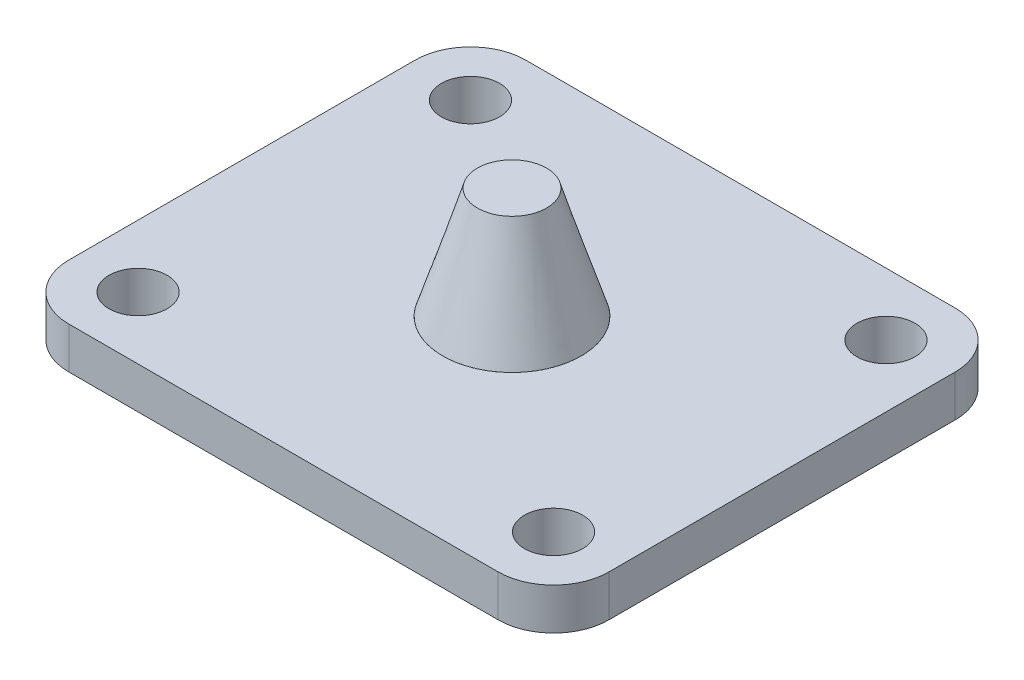
ISO-10303-21;
HEADER;
FILE_DESCRIPTION(('STEP AP214'),'2;1');
FILE_NAME('part.step','',(''),(''),'','','');
FILE_SCHEMA(('AUTOMOTIVE_DESIGN { 1 0 10303 214 1 1 1 1 }'));
ENDSEC;
DATA;
#1=APPLICATION_CONTEXT('core data for automotive mechanical design processes');
#2=APPLICATION_PROTOCOL_DEFINITION('international standard','automotive_design',2000,#1);
#3=PRODUCT_CONTEXT('',#1,'mechanical');
#4=PRODUCT('Part','Part','',(#3));
#5=PRODUCT_RELATED_PRODUCT_CATEGORY('part','',(#4));
#6=PRODUCT_DEFINITION_FORMATION('','',#4);
#7=PRODUCT_DEFINITION_CONTEXT('part definition',#1,'design');
#8=PRODUCT_DEFINITION('design','',#6,#7);
#9=PRODUCT_DEFINITION_SHAPE('','',#8);
#10=(LENGTH_UNIT() NAMED_UNIT(*) SI_UNIT(.MILLI.,.METRE.));
#11=(NAMED_UNIT(*) PLANE_ANGLE_UNIT() SI_UNIT($,.RADIAN.));
#12=(NAMED_UNIT(*) SI_UNIT($,.STERADIAN.) SOLID_ANGLE_UNIT());
#13=UNCERTAINTY_MEASURE_WITH_UNIT(LENGTH_MEASURE(1.E-05),#10,'distance_accuracy_value','');
#14=(GEOMETRIC_REPRESENTATION_CONTEXT(3) GLOBAL_UNCERTAINTY_ASSIGNED_CONTEXT((#13)) GLOBAL_UNIT_ASSIGNED_CONTEXT((#10,
#11,#12)) REPRESENTATION_CONTEXT('',''));
#15=CARTESIAN_POINT('',(0.,0.,0.));
#16=DIRECTION('',(0.,0.,1.));
#17=DIRECTION('',(1.,0.,0.));
#18=AXIS2_PLACEMENT_3D('',#15,#16,#17);
#19=CARTESIAN_POINT('',(19.5000000000001,11.,-16.5000000000005));
#20=DIRECTION('',(0.,1.,0.));
#21=DIRECTION('',(0.,0.,1.));
#22=AXIS2_PLACEMENT_3D('',#19,#20,#21);
#23=PLANE('',#22);
#24=CARTESIAN_POINT('',(19.5000000000001,11.,-16.5000000000005));
#25=DIRECTION('',(0.,1.,0.));
#26=DIRECTION('',(0.,0.,1.));
#27=AXIS2_PLACEMENT_3D('',#24,#25,#26);
#28=CIRCLE('',#27,2.5);
#29=CARTESIAN_POINT('',(21.8871613618667,11.,-15.757396046058));
#30=VERTEX_POINT('',#29);
#31=EDGE_CURVE('E12',#30,#30,#28,.T.);
#32=ORIENTED_EDGE('',*,*,#31,.T.);
#33=EDGE_LOOP('',(#32));
#34=FACE_BOUND('',#33,.T.);
#35=ADVANCED_FACE('F51',(#34),#23,.T.);
#36=CARTESIAN_POINT('',(19.5000000000001,3.,-16.5000000000005));
#37=DIRECTION('',(0.,1.,0.));
#38=DIRECTION('',(0.,0.,1.));
#39=AXIS2_PLACEMENT_3D('',#36,#37,#38);
#40=PLANE('',#39);
#41=CARTESIAN_POINT('',(19.5000000000001,3.,-16.5000000000005));
#42=DIRECTION('',(0.,1.,0.));
#43=DIRECTION('',(0.,0.,1.));
#44=AXIS2_PLACEMENT_3D('',#41,#42,#43);
#45=CIRCLE('',#44,5.);
#46=CARTESIAN_POINT('',(23.7940843704918,3.,-13.9385864412211));
#47=VERTEX_POINT('',#46);
#48=EDGE_CURVE('E59',#47,#47,#45,.T.);
#49=ORIENTED_EDGE('',*,*,#48,.F.);
#50=EDGE_LOOP('',(#49));
#51=FACE_BOUND('',#50,.T.);
#52=ADVANCED_FACE('F82',(#51),#40,.F.);
#53=CARTESIAN_POINT('',(23.7940843704918,3.,-13.9385864412211));
#54=CARTESIAN_POINT('',(21.8871613618667,11.,-15.757396046058));
#55=CARTESIAN_POINT('',(28.9169114880506,3.,-22.5267551822045));
#56=CARTESIAN_POINT('',(23.3723692697519,11.,-20.5317187697912));
#57=CARTESIAN_POINT('',(20.3287427470672,3.,-27.6495822997633));
#58=CARTESIAN_POINT('',(18.5980465460187,11.,-22.0169266776763));
#59=CARTESIAN_POINT('',(15.2059156295084,3.,-19.06141355878));
#60=CARTESIAN_POINT('',(17.1128386381335,11.,-17.2426039539431));
#61=CARTESIAN_POINT('',(10.0830885119496,3.,-10.4732448177966));
#62=CARTESIAN_POINT('',(15.6276307302483,11.,-12.4682812302099));
#63=CARTESIAN_POINT('',(18.671257252933,3.,-5.35041770023775));
#64=CARTESIAN_POINT('',(20.4019534539816,11.,-10.9830733223247));
#65=CARTESIAN_POINT('',(23.7940843704918,3.,-13.9385864412211));
#66=CARTESIAN_POINT('',(21.8871613618667,11.,-15.757396046058));
#67=(BOUNDED_SURFACE() B_SPLINE_SURFACE(3,1,((#53,#54),(#55,#56),(#57,#58),(#59,#60),(#61,#62),
(#63,#64),(#65,#66)),.UNSPECIFIED.,.T.,.F.,.F.) B_SPLINE_SURFACE_WITH_KNOTS((4,3,4),(2,2),(0.,
0.5,1.),(0.,1.),.UNSPECIFIED.) GEOMETRIC_REPRESENTATION_ITEM() RATIONAL_B_SPLINE_SURFACE(((1.,
1.),(0.333333333333333,0.333333333333333),(0.333333333333333,0.333333333333333),(1.,1.),
(0.333333333333333,0.333333333333333),(0.333333333333333,0.333333333333333),(1.,1.))) REPRESENTATION_ITEM('') SURFACE());
#68=CARTESIAN_POINT('',(23.7940843704918,3.,-13.9385864412211));
#69=CARTESIAN_POINT('',(23.774220589152,3.08333333333333,-13.9575323746049));
#70=CARTESIAN_POINT('',(23.7543568078121,3.16666666666667,-13.9764783079886));
#71=CARTESIAN_POINT('',(23.7146292451324,3.33333333333333,-14.014370174756));
#72=CARTESIAN_POINT('',(23.6947654637926,3.41666666666667,-14.0333161081397));
#73=CARTESIAN_POINT('',(23.6550379011129,3.58333333333333,-14.0712079749072));
#74=CARTESIAN_POINT('',(23.6351741197731,3.66666666666667,-14.0901539082909));
#75=CARTESIAN_POINT('',(23.5954465570934,3.83333333333333,-14.1280457750583));
#76=CARTESIAN_POINT('',(23.5755827757535,3.91666666666667,-14.146991708442));
#77=CARTESIAN_POINT('',(23.5358552130738,4.08333333333333,-14.1848835752095));
#78=CARTESIAN_POINT('',(23.515991431734,4.16666666666667,-14.2038295085932));
#79=CARTESIAN_POINT('',(23.4762638690543,4.33333333333333,-14.2417213753606));
#80=CARTESIAN_POINT('',(23.4564000877145,4.41666666666667,-14.2606673087443));
#81=CARTESIAN_POINT('',(23.4166725250348,4.58333333333333,-14.2985591755118));
#82=CARTESIAN_POINT('',(23.3968087436949,4.66666666666667,-14.3175051088955));
#83=CARTESIAN_POINT('',(23.3570811810152,4.83333333333333,-14.3553969756629));
#84=CARTESIAN_POINT('',(23.3372173996754,4.91666666666667,-14.3743429090466));
#85=CARTESIAN_POINT('',(23.2974898369957,5.08333333333333,-14.4122347758141));
#86=CARTESIAN_POINT('',(23.2776260556559,5.16666666666667,-14.4311807091978));
#87=CARTESIAN_POINT('',(23.2378984929762,5.33333333333333,-14.4690725759652));
#88=CARTESIAN_POINT('',(23.2180347116363,5.41666666666667,-14.4880185093489));
#89=CARTESIAN_POINT('',(23.1783071489566,5.58333333333333,-14.5259103761164));
#90=CARTESIAN_POINT('',(23.1584433676168,5.66666666666667,-14.5448563095001));
#91=CARTESIAN_POINT('',(23.1187158049371,5.83333333333333,-14.5827481762675));
#92=CARTESIAN_POINT('',(23.0988520235972,5.91666666666667,-14.6016941096512));
#93=CARTESIAN_POINT('',(23.0591244609176,6.08333333333333,-14.6395859764187));
#94=CARTESIAN_POINT('',(23.0392606795777,6.16666666666667,-14.6585319098024));
#95=CARTESIAN_POINT('',(22.999533116898,6.33333333333333,-14.6964237765698));
#96=CARTESIAN_POINT('',(22.9796693355582,6.41666666666667,-14.7153697099535));
#97=CARTESIAN_POINT('',(22.9399417728785,6.58333333333333,-14.753261576721));
#98=CARTESIAN_POINT('',(22.9200779915386,6.66666666666667,-14.7722075101047));
#99=CARTESIAN_POINT('',(22.880350428859,6.83333333333333,-14.8100993768721));
#100=CARTESIAN_POINT('',(22.8604866475191,6.91666666666667,-14.8290453102558));
#101=CARTESIAN_POINT('',(22.8207590848394,7.08333333333333,-14.8669371770233));
#102=CARTESIAN_POINT('',(22.8008953034996,7.16666666666667,-14.885883110407));
#103=CARTESIAN_POINT('',(22.7611677408199,7.33333333333333,-14.9237749771744));
#104=CARTESIAN_POINT('',(22.74130395948,7.41666666666667,-14.9427209105581));
#105=CARTESIAN_POINT('',(22.7015763968004,7.58333333333333,-14.9806127773256));
#106=CARTESIAN_POINT('',(22.6817126154605,7.66666666666667,-14.9995587107093));
#107=CARTESIAN_POINT('',(22.6419850527808,7.83333333333333,-15.0374505774767));
#108=CARTESIAN_POINT('',(22.622121271441,7.91666666666667,-15.0563965108604));
#109=CARTESIAN_POINT('',(22.5823937087613,8.08333333333333,-15.0942883776279));
#110=CARTESIAN_POINT('',(22.5625299274214,8.16666666666667,-15.1132343110116));
#111=CARTESIAN_POINT('',(22.5228023647418,8.33333333333333,-15.151126177779));
#112=CARTESIAN_POINT('',(22.5029385834019,8.41666666666667,-15.1700721111627));
#113=CARTESIAN_POINT('',(22.4632110207222,8.58333333333333,-15.2079639779302));
#114=CARTESIAN_POINT('',(22.4433472393824,8.66666666666667,-15.2269099113139));
#115=CARTESIAN_POINT('',(22.4036196767027,8.83333333333333,-15.2648017780813));
#116=CARTESIAN_POINT('',(22.3837558953628,8.91666666666667,-15.283747711465));
#117=CARTESIAN_POINT('',(22.3440283326832,9.08333333333333,-15.3216395782325));
#118=CARTESIAN_POINT('',(22.3241645513433,9.16666666666667,-15.3405855116162));
#119=CARTESIAN_POINT('',(22.2844369886636,9.33333333333333,-15.3784773783836));
#120=CARTESIAN_POINT('',(22.2645732073238,9.41666666666667,-15.3974233117673));
#121=CARTESIAN_POINT('',(22.2248456446441,9.58333333333333,-15.4353151785348));
#122=CARTESIAN_POINT('',(22.2049818633042,9.66666666666667,-15.4542611119185));
#123=CARTESIAN_POINT('',(22.1652543006245,9.83333333333333,-15.4921529786859));
#124=CARTESIAN_POINT('',(22.1453905192847,9.91666666666667,-15.5110989120696));
#125=CARTESIAN_POINT('',(22.105662956605,10.0833333333333,-15.5489907788371));
#126=CARTESIAN_POINT('',(22.0857991752652,10.1666666666667,-15.5679367122208));
#127=CARTESIAN_POINT('',(22.0460716125855,10.3333333333333,-15.6058285789882));
#128=CARTESIAN_POINT('',(22.0262078312456,10.4166666666667,-15.6247745123719));
#129=CARTESIAN_POINT('',(21.9864802685659,10.5833333333333,-15.6626663791394));
#130=CARTESIAN_POINT('',(21.9666164872261,10.6666666666667,-15.6816123125231));
#131=CARTESIAN_POINT('',(21.9268889245464,10.8333333333333,-15.7195041792905));
#132=CARTESIAN_POINT('',(21.9070251432066,10.9166666666667,-15.7384501126742));
#133=CARTESIAN_POINT('',(21.8871613618667,11.,-15.757396046058));
#134=B_SPLINE_CURVE_WITH_KNOTS('',3,(#68,#69,#70,#71,#72,#73,#74,#75,#76,#77,#78,#79,#80,#81,
#82,#83,#84,#85,#86,#87,#88,#89,#90,#91,#92,#93,#94,#95,#96,#97,#98,#99,#100,#101,#102,#103,
#104,#105,#106,#107,#108,#109,#110,#111,#112,#113,#114,#115,#116,#117,#118,#119,#120,#121,#122,
#123,#124,#125,#126,#127,#128,#129,#130,#131,#132,#133),.UNSPECIFIED.,.F.,.F.,(4,2,2,2,2,2,2,2,
2,2,2,2,2,2,2,2,2,2,2,2,2,2,2,2,2,2,2,2,2,2,2,2,4),(0.,0.26321410260105,0.526428205202101,
0.789642307803153,1.0528564104042,1.31607051300526,1.57928461560631,1.84249871820736,
2.10571282080841,2.36892692340946,2.63214102601051,2.89535512861156,3.15856923121261,
3.42178333381366,3.68499743641471,3.94821153901576,4.21142564161681,4.47463974421787,
4.73785384681892,5.00106794941997,5.26428205202102,5.52749615462207,5.79071025722312,
6.05392435982417,6.31713846242523,6.58035256502628,6.84356666762733,7.10678077022838,
7.36999487282943,7.63320897543048,7.89642307803153,8.15963718063258,8.42285128323363),.UNSPECIFIED.);
#135=EDGE_CURVE('BSEAM90',#47,#30,#134,.T.);
#136=ORIENTED_EDGE('',*,*,#48,.T.);
#137=ORIENTED_EDGE('',*,*,#31,.F.);
#138=ORIENTED_EDGE('',*,*,#135,.T.);
#139=ORIENTED_EDGE('',*,*,#135,.F.);
#140=EDGE_LOOP('',(#136,#138,#137,#139));
#141=FACE_BOUND('',#140,.T.);
#142=ADVANCED_FACE('F90',(#141),#67,.T.);
#143=CLOSED_SHELL('',(#35,#52,#142));
#144=MANIFOLD_SOLID_BREP('B2',#143);
#145=CARTESIAN_POINT('',(0.,3.,0.));
#146=DIRECTION('',(0.,-1.,0.));
#147=DIRECTION('',(0.,0.,-1.));
#148=AXIS2_PLACEMENT_3D('',#145,#146,#147);
#149=PLANE('',#148);
#150=CARTESIAN_POINT('',(19.5000000000001,3.,-16.5000000000005));
#151=DIRECTION('',(0.,1.,0.));
#152=DIRECTION('',(0.,0.,1.));
#153=AXIS2_PLACEMENT_3D('',#150,#151,#152);
#154=CIRCLE('',#153,5.);
#155=CARTESIAN_POINT('',(19.5000000000001,3.,-11.5000000000005));
#156=VERTEX_POINT('',#155);
#157=EDGE_CURVE('E343',#156,#156,#154,.T.);
#158=ORIENTED_EDGE('',*,*,#157,.F.);
#159=EDGE_LOOP('',(#158));
#160=FACE_BOUND('',#159,.T.);
#161=DIRECTION('',(0.,0.,1.));
#162=VECTOR('',#161,1.);
#163=CARTESIAN_POINT('',(0.,3.,0.));
#164=LINE('',#163,#162);
#165=CARTESIAN_POINT('',(0.,3.,-29.0000000000001));
#166=VERTEX_POINT('',#165);
#167=CARTESIAN_POINT('',(0.,3.,-4.00000000000006));
#168=VERTEX_POINT('',#167);
#169=EDGE_CURVE('E254',#166,#168,#164,.T.);
#170=ORIENTED_EDGE('',*,*,#169,.T.);
#171=CARTESIAN_POINT('',(4.,3.,-4.00000000000006));
#172=DIRECTION('',(0.,-1.,0.));
#173=DIRECTION('',(0.,0.,-1.));
#174=AXIS2_PLACEMENT_3D('',#171,#172,#173);
#175=CIRCLE('',#174,4.);
#176=CARTESIAN_POINT('',(4.00000000000006,3.,0.));
#177=VERTEX_POINT('',#176);
#178=EDGE_CURVE('E278',#168,#177,#175,.F.);
#179=ORIENTED_EDGE('',*,*,#178,.T.);
#180=DIRECTION('',(1.,0.,0.));
#181=VECTOR('',#180,1.);
#182=CARTESIAN_POINT('',(0.,3.,0.));
#183=LINE('',#182,#181);
#184=CARTESIAN_POINT('',(35.0000000000004,3.,-4.88807387438045E-13));
#185=VERTEX_POINT('',#184);
#186=EDGE_CURVE('E231',#177,#185,#183,.T.);
#187=ORIENTED_EDGE('',*,*,#186,.T.);
#188=CARTESIAN_POINT('',(35.0000000000004,3.,-4.00000000000049));
#189=DIRECTION('',(0.,-1.,0.));
#190=DIRECTION('',(0.,0.,-1.));
#191=AXIS2_PLACEMENT_3D('',#188,#189,#190);
#192=CIRCLE('',#191,4.);
#193=CARTESIAN_POINT('',(39.0000000000004,3.,-4.00000000000054));
#194=VERTEX_POINT('',#193);
#195=EDGE_CURVE('E270',#185,#194,#192,.F.);
#196=ORIENTED_EDGE('',*,*,#195,.T.);
#197=DIRECTION('',(0.,0.,-1.));
#198=VECTOR('',#197,1.);
#199=CARTESIAN_POINT('',(39.0000000000004,3.,-5.44671088859535E-13));
#200=LINE('',#199,#198);
#201=CARTESIAN_POINT('',(39.0000000000001,3.,-29.0000000000005));
#202=VERTEX_POINT('',#201);
#203=EDGE_CURVE('E293',#194,#202,#200,.T.);
#204=ORIENTED_EDGE('',*,*,#203,.T.);
#205=CARTESIAN_POINT('',(35.,3.,-29.0000000000005));
#206=DIRECTION('',(0.,-1.,0.));
#207=DIRECTION('',(0.,0.,-1.));
#208=AXIS2_PLACEMENT_3D('',#205,#206,#207);
#209=CIRCLE('',#208,4.);
#210=CARTESIAN_POINT('',(35.,3.,-33.0000000000005));
#211=VERTEX_POINT('',#210);
#212=EDGE_CURVE('E166',#202,#211,#209,.F.);
#213=ORIENTED_EDGE('',*,*,#212,.T.);
#214=DIRECTION('',(-1.,0.,0.));
#215=VECTOR('',#214,1.);
#216=CARTESIAN_POINT('',(0.,3.,-33.));
#217=LINE('',#216,#215);
#218=CARTESIAN_POINT('',(3.99999999999994,3.,-33.0000000000001));
#219=VERTEX_POINT('',#218);
#220=EDGE_CURVE('E256',#211,#219,#217,.T.);
#221=ORIENTED_EDGE('',*,*,#220,.T.);
#222=CARTESIAN_POINT('',(4.,3.,-29.0000000000001));
#223=DIRECTION('',(0.,-1.,0.));
#224=DIRECTION('',(0.,0.,-1.));
#225=AXIS2_PLACEMENT_3D('',#222,#223,#224);
#226=CIRCLE('',#225,4.);
#227=EDGE_CURVE('E275',#219,#166,#226,.F.);
#228=ORIENTED_EDGE('',*,*,#227,.T.);
#229=EDGE_LOOP('',(#170,#179,#187,#196,#204,#213,#221,#228));
#230=FACE_BOUND('',#229,.T.);
#231=CARTESIAN_POINT('',(4.49999999999967,3.,-28.5000000000001));
#232=DIRECTION('',(0.,1.,0.));
#233=DIRECTION('',(0.,0.,1.));
#234=AXIS2_PLACEMENT_3D('',#231,#232,#233);
#235=CIRCLE('',#234,2.1000000000003);
#236=CARTESIAN_POINT('',(4.49999999999967,3.,-26.3999999999998));
#237=VERTEX_POINT('',#236);
#238=EDGE_CURVE('E248',#237,#237,#235,.T.);
#239=ORIENTED_EDGE('',*,*,#238,.F.);
#240=EDGE_LOOP('',(#239));
#241=FACE_BOUND('',#240,.T.);
#242=CARTESIAN_POINT('',(34.4999999999997,3.,-28.5000000000005));
#243=DIRECTION('',(0.,1.,0.));
#244=DIRECTION('',(0.,0.,1.));
#245=AXIS2_PLACEMENT_3D('',#242,#243,#244);
#246=CIRCLE('',#245,2.10000000000019);
#247=CARTESIAN_POINT('',(34.4999999999997,3.,-26.4000000000003));
#248=VERTEX_POINT('',#247);
#249=EDGE_CURVE('E315',#248,#248,#246,.T.);
#250=ORIENTED_EDGE('',*,*,#249,.F.);
#251=EDGE_LOOP('',(#250));
#252=FACE_BOUND('',#251,.T.);
#253=CARTESIAN_POINT('',(34.4999999999999,3.,-4.50000000000048));
#254=DIRECTION('',(0.,1.,0.));
#255=DIRECTION('',(0.,0.,1.));
#256=AXIS2_PLACEMENT_3D('',#253,#254,#255);
#257=CIRCLE('',#256,2.10000000000022);
#258=CARTESIAN_POINT('',(34.4999999999999,3.,-2.40000000000026));
#259=VERTEX_POINT('',#258);
#260=EDGE_CURVE('E323',#259,#259,#257,.T.);
#261=ORIENTED_EDGE('',*,*,#260,.F.);
#262=EDGE_LOOP('',(#261));
#263=FACE_BOUND('',#262,.T.);
#264=CARTESIAN_POINT('',(4.5,3.,-4.50000000000006));
#265=DIRECTION('',(0.,1.,0.));
#266=DIRECTION('',(0.,0.,1.));
#267=AXIS2_PLACEMENT_3D('',#264,#265,#266);
#268=CIRCLE('',#267,2.09999999999998);
#269=CARTESIAN_POINT('',(4.5,3.,-2.40000000000008));
#270=VERTEX_POINT('',#269);
#271=EDGE_CURVE('E331',#270,#270,#268,.T.);
#272=ORIENTED_EDGE('',*,*,#271,.F.);
#273=EDGE_LOOP('',(#272));
#274=FACE_BOUND('',#273,.T.);
#275=ADVANCED_FACE('F143',(#160,#230,#241,#252,#263,#274),#149,.F.);
#276=CARTESIAN_POINT('',(0.,0.,0.));
#277=DIRECTION('',(0.,-1.,0.));
#278=DIRECTION('',(0.,0.,-1.));
#279=AXIS2_PLACEMENT_3D('',#276,#277,#278);
#280=PLANE('',#279);
#281=CARTESIAN_POINT('',(19.5000000000001,0.,-16.5000000000005));
#282=DIRECTION('',(0.,1.,0.));
#283=DIRECTION('',(0.,0.,1.));
#284=AXIS2_PLACEMENT_3D('',#281,#282,#283);
#285=CIRCLE('',#284,5.);
#286=CARTESIAN_POINT('',(19.5000000000001,0.,-11.5000000000005));
#287=VERTEX_POINT('',#286);
#288=EDGE_CURVE('E339',#287,#287,#285,.T.);
#289=ORIENTED_EDGE('',*,*,#288,.T.);
#290=EDGE_LOOP('',(#289));
#291=FACE_BOUND('',#290,.T.);
#292=CARTESIAN_POINT('',(34.4999999999999,0.,-4.50000000000048));
#293=DIRECTION('',(0.,1.,0.));
#294=DIRECTION('',(0.,0.,1.));
#295=AXIS2_PLACEMENT_3D('',#292,#293,#294);
#296=CIRCLE('',#295,2.10000000000022);
#297=CARTESIAN_POINT('',(34.4999999999999,0.,-2.40000000000026));
#298=VERTEX_POINT('',#297);
#299=EDGE_CURVE('E327',#298,#298,#296,.T.);
#300=ORIENTED_EDGE('',*,*,#299,.T.);
#301=EDGE_LOOP('',(#300));
#302=FACE_BOUND('',#301,.T.);
#303=CARTESIAN_POINT('',(4.49999999999967,0.,-28.5000000000001));
#304=DIRECTION('',(0.,1.,0.));
#305=DIRECTION('',(0.,0.,1.));
#306=AXIS2_PLACEMENT_3D('',#303,#304,#305);
#307=CIRCLE('',#306,2.1000000000003);
#308=CARTESIAN_POINT('',(4.49999999999967,0.,-26.3999999999998));
#309=VERTEX_POINT('',#308);
#310=EDGE_CURVE('E311',#309,#309,#307,.T.);
#311=ORIENTED_EDGE('',*,*,#310,.T.);
#312=EDGE_LOOP('',(#311));
#313=FACE_BOUND('',#312,.T.);
#314=DIRECTION('',(1.,0.,0.));
#315=VECTOR('',#314,1.);
#316=CARTESIAN_POINT('',(0.,0.,0.));
#317=LINE('',#316,#315);
#318=CARTESIAN_POINT('',(4.00000000000006,0.,0.));
#319=VERTEX_POINT('',#318);
#320=CARTESIAN_POINT('',(35.0000000000004,0.,-4.88807387438045E-13));
#321=VERTEX_POINT('',#320);
#322=EDGE_CURVE('E228',#319,#321,#317,.T.);
#323=ORIENTED_EDGE('',*,*,#322,.F.);
#324=CARTESIAN_POINT('',(4.,0.,-4.00000000000006));
#325=DIRECTION('',(0.,-1.,0.));
#326=DIRECTION('',(0.,0.,-1.));
#327=AXIS2_PLACEMENT_3D('',#324,#325,#326);
#328=CIRCLE('',#327,4.);
#329=CARTESIAN_POINT('',(0.,0.,-4.00000000000006));
#330=VERTEX_POINT('',#329);
#331=EDGE_CURVE('E210',#319,#330,#328,.T.);
#332=ORIENTED_EDGE('',*,*,#331,.T.);
#333=DIRECTION('',(0.,0.,1.));
#334=VECTOR('',#333,1.);
#335=CARTESIAN_POINT('',(0.,0.,0.));
#336=LINE('',#335,#334);
#337=CARTESIAN_POINT('',(0.,0.,-29.0000000000001));
#338=VERTEX_POINT('',#337);
#339=EDGE_CURVE('E241',#338,#330,#336,.T.);
#340=ORIENTED_EDGE('',*,*,#339,.F.);
#341=CARTESIAN_POINT('',(4.,0.,-29.0000000000001));
#342=DIRECTION('',(0.,-1.,0.));
#343=DIRECTION('',(0.,0.,-1.));
#344=AXIS2_PLACEMENT_3D('',#341,#342,#343);
#345=CIRCLE('',#344,4.);
#346=CARTESIAN_POINT('',(3.99999999999994,0.,-33.0000000000001));
#347=VERTEX_POINT('',#346);
#348=EDGE_CURVE('E222',#338,#347,#345,.T.);
#349=ORIENTED_EDGE('',*,*,#348,.T.);
#350=DIRECTION('',(-1.,0.,0.));
#351=VECTOR('',#350,1.);
#352=CARTESIAN_POINT('',(0.,0.,-33.));
#353=LINE('',#352,#351);
#354=CARTESIAN_POINT('',(35.,0.,-33.0000000000005));
#355=VERTEX_POINT('',#354);
#356=EDGE_CURVE('E246',#355,#347,#353,.T.);
#357=ORIENTED_EDGE('',*,*,#356,.F.);
#358=CARTESIAN_POINT('',(35.,0.,-29.0000000000005));
#359=DIRECTION('',(0.,-1.,0.));
#360=DIRECTION('',(0.,0.,-1.));
#361=AXIS2_PLACEMENT_3D('',#358,#359,#360);
#362=CIRCLE('',#361,4.);
#363=CARTESIAN_POINT('',(39.0000000000001,0.,-29.0000000000005));
#364=VERTEX_POINT('',#363);
#365=EDGE_CURVE('E260',#355,#364,#362,.T.);
#366=ORIENTED_EDGE('',*,*,#365,.T.);
#367=DIRECTION('',(0.,0.,-1.));
#368=VECTOR('',#367,1.);
#369=CARTESIAN_POINT('',(39.0000000000004,0.,-5.44671088859535E-13));
#370=LINE('',#369,#368);
#371=CARTESIAN_POINT('',(39.0000000000004,0.,-4.00000000000054));
#372=VERTEX_POINT('',#371);
#373=EDGE_CURVE('E240',#372,#364,#370,.T.);
#374=ORIENTED_EDGE('',*,*,#373,.F.);
#375=CARTESIAN_POINT('',(35.0000000000004,0.,-4.00000000000049));
#376=DIRECTION('',(0.,-1.,0.));
#377=DIRECTION('',(0.,0.,-1.));
#378=AXIS2_PLACEMENT_3D('',#375,#376,#377);
#379=CIRCLE('',#378,4.);
#380=EDGE_CURVE('E233',#372,#321,#379,.T.);
#381=ORIENTED_EDGE('',*,*,#380,.T.);
#382=EDGE_LOOP('',(#323,#332,#340,#349,#357,#366,#374,#381));
#383=FACE_BOUND('',#382,.T.);
#384=CARTESIAN_POINT('',(34.4999999999997,0.,-28.5000000000005));
#385=DIRECTION('',(0.,1.,0.));
#386=DIRECTION('',(0.,0.,1.));
#387=AXIS2_PLACEMENT_3D('',#384,#385,#386);
#388=CIRCLE('',#387,2.10000000000019);
#389=CARTESIAN_POINT('',(34.4999999999997,0.,-26.4000000000003));
#390=VERTEX_POINT('',#389);
#391=EDGE_CURVE('E319',#390,#390,#388,.T.);
#392=ORIENTED_EDGE('',*,*,#391,.T.);
#393=EDGE_LOOP('',(#392));
#394=FACE_BOUND('',#393,.T.);
#395=CARTESIAN_POINT('',(4.5,0.,-4.50000000000006));
#396=DIRECTION('',(0.,1.,0.));
#397=DIRECTION('',(0.,0.,1.));
#398=AXIS2_PLACEMENT_3D('',#395,#396,#397);
#399=CIRCLE('',#398,2.09999999999998);
#400=CARTESIAN_POINT('',(4.5,0.,-2.40000000000008));
#401=VERTEX_POINT('',#400);
#402=EDGE_CURVE('E335',#401,#401,#399,.T.);
#403=ORIENTED_EDGE('',*,*,#402,.T.);
#404=EDGE_LOOP('',(#403));
#405=FACE_BOUND('',#404,.T.);
#406=ADVANCED_FACE('F236',(#291,#302,#313,#383,#394,#405),#280,.T.);
#407=CARTESIAN_POINT('',(0.,3.,0.));
#408=DIRECTION('',(1.,0.,0.));
#409=DIRECTION('',(0.,0.,-1.));
#410=AXIS2_PLACEMENT_3D('',#407,#408,#409);
#411=PLANE('',#410);
#412=ORIENTED_EDGE('',*,*,#339,.T.);
#413=DIRECTION('',(0.,-1.,0.));
#414=VECTOR('',#413,1.);
#415=CARTESIAN_POINT('',(0.,3.,-4.00000000000006));
#416=LINE('',#415,#414);
#417=EDGE_CURVE('E215',#330,#168,#416,.F.);
#418=ORIENTED_EDGE('',*,*,#417,.T.);
#419=ORIENTED_EDGE('',*,*,#169,.F.);
#420=DIRECTION('',(0.,-1.,0.));
#421=VECTOR('',#420,1.);
#422=CARTESIAN_POINT('',(0.,3.,-29.0000000000001));
#423=LINE('',#422,#421);
#424=EDGE_CURVE('E221',#166,#338,#423,.T.);
#425=ORIENTED_EDGE('',*,*,#424,.T.);
#426=EDGE_LOOP('',(#412,#418,#419,#425));
#427=FACE_BOUND('',#426,.T.);
#428=ADVANCED_FACE('F379',(#427),#411,.F.);
#429=CARTESIAN_POINT('',(0.,3.,0.));
#430=DIRECTION('',(0.,0.,-1.));
#431=DIRECTION('',(-1.,0.,0.));
#432=AXIS2_PLACEMENT_3D('',#429,#430,#431);
#433=PLANE('',#432);
#434=ORIENTED_EDGE('',*,*,#186,.F.);
#435=DIRECTION('',(0.,-1.,0.));
#436=VECTOR('',#435,1.);
#437=CARTESIAN_POINT('',(4.00000000000006,3.,0.));
#438=LINE('',#437,#436);
#439=EDGE_CURVE('E214',#177,#319,#438,.T.);
#440=ORIENTED_EDGE('',*,*,#439,.T.);
#441=ORIENTED_EDGE('',*,*,#322,.T.);
#442=DIRECTION('',(0.,-1.,0.));
#443=VECTOR('',#442,1.);
#444=CARTESIAN_POINT('',(35.0000000000004,3.,-4.88807387438045E-13));
#445=LINE('',#444,#443);
#446=EDGE_CURVE('E234',#321,#185,#445,.F.);
#447=ORIENTED_EDGE('',*,*,#446,.T.);
#448=EDGE_LOOP('',(#434,#440,#441,#447));
#449=FACE_BOUND('',#448,.T.);
#450=ADVANCED_FACE('F227',(#449),#433,.F.);
#451=CARTESIAN_POINT('',(39.0000000000004,3.,-5.44671088859535E-13));
#452=DIRECTION('',(-1.,0.,0.));
#453=DIRECTION('',(0.,0.,1.));
#454=AXIS2_PLACEMENT_3D('',#451,#452,#453);
#455=PLANE('',#454);
#456=ORIENTED_EDGE('',*,*,#373,.T.);
#457=DIRECTION('',(0.,-1.,0.));
#458=VECTOR('',#457,1.);
#459=CARTESIAN_POINT('',(39.0000000000001,3.,-29.0000000000005));
#460=LINE('',#459,#458);
#461=EDGE_CURVE('E49',#364,#202,#460,.F.);
#462=ORIENTED_EDGE('',*,*,#461,.T.);
#463=ORIENTED_EDGE('',*,*,#203,.F.);
#464=DIRECTION('',(0.,-1.,0.));
#465=VECTOR('',#464,1.);
#466=CARTESIAN_POINT('',(39.0000000000004,3.,-4.00000000000054));
#467=LINE('',#466,#465);
#468=EDGE_CURVE('E152',#194,#372,#467,.T.);
#469=ORIENTED_EDGE('',*,*,#468,.T.);
#470=EDGE_LOOP('',(#456,#462,#463,#469));
#471=FACE_BOUND('',#470,.T.);
#472=ADVANCED_FACE('F291',(#471),#455,.F.);
#473=CARTESIAN_POINT('',(0.,3.,-33.));
#474=DIRECTION('',(0.,0.,1.));
#475=DIRECTION('',(1.,0.,0.));
#476=AXIS2_PLACEMENT_3D('',#473,#474,#475);
#477=PLANE('',#476);
#478=ORIENTED_EDGE('',*,*,#356,.T.);
#479=DIRECTION('',(0.,-1.,0.));
#480=VECTOR('',#479,1.);
#481=CARTESIAN_POINT('',(3.99999999999994,3.,-33.0000000000001));
#482=LINE('',#481,#480);
#483=EDGE_CURVE('E159',#347,#219,#482,.F.);
#484=ORIENTED_EDGE('',*,*,#483,.T.);
#485=ORIENTED_EDGE('',*,*,#220,.F.);
#486=DIRECTION('',(0.,-1.,0.));
#487=VECTOR('',#486,1.);
#488=CARTESIAN_POINT('',(35.,3.,-33.0000000000005));
#489=LINE('',#488,#487);
#490=EDGE_CURVE('E281',#211,#355,#489,.T.);
#491=ORIENTED_EDGE('',*,*,#490,.T.);
#492=EDGE_LOOP('',(#478,#484,#485,#491));
#493=FACE_BOUND('',#492,.T.);
#494=ADVANCED_FACE('F300',(#493),#477,.F.);
#495=CARTESIAN_POINT('',(4.49999999999967,3.,-28.5000000000001));
#496=DIRECTION('',(0.,-1.,0.));
#497=DIRECTION('',(0.,0.,-1.));
#498=AXIS2_PLACEMENT_3D('',#495,#496,#497);
#499=CYLINDRICAL_SURFACE('',#498,2.1000000000003);
#500=ORIENTED_EDGE('',*,*,#238,.T.);
#501=EDGE_LOOP('',(#500));
#502=FACE_BOUND('',#501,.T.);
#503=ORIENTED_EDGE('',*,*,#310,.F.);
#504=EDGE_LOOP('',(#503));
#505=FACE_BOUND('',#504,.T.);
#506=ADVANCED_FACE('F390',(#502,#505),#499,.F.);
#507=CARTESIAN_POINT('',(34.4999999999997,3.,-28.5000000000005));
#508=DIRECTION('',(0.,-1.,0.));
#509=DIRECTION('',(0.,0.,-1.));
#510=AXIS2_PLACEMENT_3D('',#507,#508,#509);
#511=CYLINDRICAL_SURFACE('',#510,2.10000000000019);
#512=ORIENTED_EDGE('',*,*,#249,.T.);
#513=EDGE_LOOP('',(#512));
#514=FACE_BOUND('',#513,.T.);
#515=ORIENTED_EDGE('',*,*,#391,.F.);
#516=EDGE_LOOP('',(#515));
#517=FACE_BOUND('',#516,.T.);
#518=ADVANCED_FACE('F452',(#514,#517),#511,.F.);
#519=CARTESIAN_POINT('',(34.4999999999999,3.,-4.50000000000048));
#520=DIRECTION('',(0.,-1.,0.));
#521=DIRECTION('',(0.,0.,-1.));
#522=AXIS2_PLACEMENT_3D('',#519,#520,#521);
#523=CYLINDRICAL_SURFACE('',#522,2.10000000000022);
#524=ORIENTED_EDGE('',*,*,#260,.T.);
#525=EDGE_LOOP('',(#524));
#526=FACE_BOUND('',#525,.T.);
#527=ORIENTED_EDGE('',*,*,#299,.F.);
#528=EDGE_LOOP('',(#527));
#529=FACE_BOUND('',#528,.T.);
#530=ADVANCED_FACE('F374',(#526,#529),#523,.F.);
#531=CARTESIAN_POINT('',(4.5,3.,-4.50000000000006));
#532=DIRECTION('',(0.,-1.,0.));
#533=DIRECTION('',(0.,0.,-1.));
#534=AXIS2_PLACEMENT_3D('',#531,#532,#533);
#535=CYLINDRICAL_SURFACE('',#534,2.09999999999998);
#536=ORIENTED_EDGE('',*,*,#271,.T.);
#537=EDGE_LOOP('',(#536));
#538=FACE_BOUND('',#537,.T.);
#539=ORIENTED_EDGE('',*,*,#402,.F.);
#540=EDGE_LOOP('',(#539));
#541=FACE_BOUND('',#540,.T.);
#542=ADVANCED_FACE('F371',(#538,#541),#535,.F.);
#543=CARTESIAN_POINT('',(4.,3.,-4.00000000000006));
#544=DIRECTION('',(0.,-1.,0.));
#545=DIRECTION('',(0.,0.,-1.));
#546=AXIS2_PLACEMENT_3D('',#543,#544,#545);
#547=CYLINDRICAL_SURFACE('',#546,4.);
#548=ORIENTED_EDGE('',*,*,#178,.F.);
#549=ORIENTED_EDGE('',*,*,#417,.F.);
#550=ORIENTED_EDGE('',*,*,#331,.F.);
#551=ORIENTED_EDGE('',*,*,#439,.F.);
#552=EDGE_LOOP('',(#548,#549,#550,#551));
#553=FACE_BOUND('',#552,.T.);
#554=ADVANCED_FACE('F213',(#553),#547,.T.);
#555=CARTESIAN_POINT('',(4.,3.,-29.0000000000001));
#556=DIRECTION('',(0.,-1.,0.));
#557=DIRECTION('',(0.,0.,-1.));
#558=AXIS2_PLACEMENT_3D('',#555,#556,#557);
#559=CYLINDRICAL_SURFACE('',#558,4.);
#560=ORIENTED_EDGE('',*,*,#227,.F.);
#561=ORIENTED_EDGE('',*,*,#483,.F.);
#562=ORIENTED_EDGE('',*,*,#348,.F.);
#563=ORIENTED_EDGE('',*,*,#424,.F.);
#564=EDGE_LOOP('',(#560,#561,#562,#563));
#565=FACE_BOUND('',#564,.T.);
#566=ADVANCED_FACE('F397',(#565),#559,.T.);
#567=CARTESIAN_POINT('',(35.,3.,-29.0000000000005));
#568=DIRECTION('',(0.,-1.,0.));
#569=DIRECTION('',(0.,0.,-1.));
#570=AXIS2_PLACEMENT_3D('',#567,#568,#569);
#571=CYLINDRICAL_SURFACE('',#570,4.);
#572=ORIENTED_EDGE('',*,*,#212,.F.);
#573=ORIENTED_EDGE('',*,*,#461,.F.);
#574=ORIENTED_EDGE('',*,*,#365,.F.);
#575=ORIENTED_EDGE('',*,*,#490,.F.);
#576=EDGE_LOOP('',(#572,#573,#574,#575));
#577=FACE_BOUND('',#576,.T.);
#578=ADVANCED_FACE('F299',(#577),#571,.T.);
#579=CARTESIAN_POINT('',(35.0000000000004,3.,-4.00000000000049));
#580=DIRECTION('',(0.,-1.,0.));
#581=DIRECTION('',(0.,0.,-1.));
#582=AXIS2_PLACEMENT_3D('',#579,#580,#581);
#583=CYLINDRICAL_SURFACE('',#582,4.);
#584=ORIENTED_EDGE('',*,*,#195,.F.);
#585=ORIENTED_EDGE('',*,*,#446,.F.);
#586=ORIENTED_EDGE('',*,*,#380,.F.);
#587=ORIENTED_EDGE('',*,*,#468,.F.);
#588=EDGE_LOOP('',(#584,#585,#586,#587));
#589=FACE_BOUND('',#588,.T.);
#590=ADVANCED_FACE('F145',(#589),#583,.T.);
#591=CARTESIAN_POINT('',(19.5000000000001,0.,-16.5000000000005));
#592=DIRECTION('',(0.,1.,0.));
#593=DIRECTION('',(0.,0.,1.));
#594=AXIS2_PLACEMENT_3D('',#591,#592,#593);
#595=CYLINDRICAL_SURFACE('',#594,5.);
#596=ORIENTED_EDGE('',*,*,#288,.F.);
#597=EDGE_LOOP('',(#596));
#598=FACE_BOUND('',#597,.T.);
#599=ORIENTED_EDGE('',*,*,#157,.T.);
#600=EDGE_LOOP('',(#599));
#601=FACE_BOUND('',#600,.T.);
#602=ADVANCED_FACE('F353',(#598,#601),#595,.F.);
#603=CLOSED_SHELL('',(#275,#406,#428,#450,#472,#494,#506,#518,#530,#542,#554,#566,#578,#590,#602));
#604=MANIFOLD_SOLID_BREP('B7',#603);
#605=ADVANCED_BREP_SHAPE_REPRESENTATION('',(#18,#144,#604),#14);
#606=SHAPE_DEFINITION_REPRESENTATION(#9,#605);
ENDSEC;
END-ISO-10303-21;
